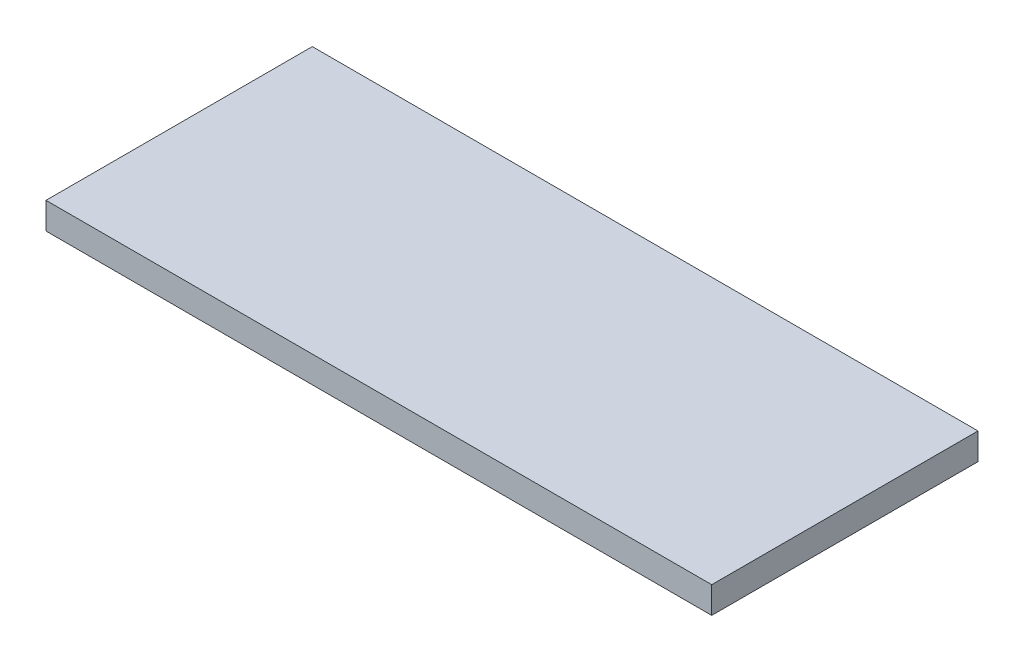
ISO-10303-21;
HEADER;
FILE_DESCRIPTION(('STEP AP214'),'2;1');
FILE_NAME('part.step','',(''),(''),'','','');
FILE_SCHEMA(('AUTOMOTIVE_DESIGN { 1 0 10303 214 1 1 1 1 }'));
ENDSEC;
DATA;
#1=APPLICATION_CONTEXT('core data for automotive mechanical design processes');
#2=APPLICATION_PROTOCOL_DEFINITION('international standard','automotive_design',2000,#1);
#3=PRODUCT_CONTEXT('',#1,'mechanical');
#4=PRODUCT('Part','Part','',(#3));
#5=PRODUCT_RELATED_PRODUCT_CATEGORY('part','',(#4));
#6=PRODUCT_DEFINITION_FORMATION('','',#4);
#7=PRODUCT_DEFINITION_CONTEXT('part definition',#1,'design');
#8=PRODUCT_DEFINITION('design','',#6,#7);
#9=PRODUCT_DEFINITION_SHAPE('','',#8);
#10=(LENGTH_UNIT() NAMED_UNIT(*) SI_UNIT(.MILLI.,.METRE.));
#11=(NAMED_UNIT(*) PLANE_ANGLE_UNIT() SI_UNIT($,.RADIAN.));
#12=(NAMED_UNIT(*) SI_UNIT($,.STERADIAN.) SOLID_ANGLE_UNIT());
#13=UNCERTAINTY_MEASURE_WITH_UNIT(LENGTH_MEASURE(1.E-05),#10,'distance_accuracy_value','');
#14=(GEOMETRIC_REPRESENTATION_CONTEXT(3) GLOBAL_UNCERTAINTY_ASSIGNED_CONTEXT((#13)) GLOBAL_UNIT_ASSIGNED_CONTEXT((#10,
#11,#12)) REPRESENTATION_CONTEXT('',''));
#15=CARTESIAN_POINT('',(0.,0.,0.));
#16=DIRECTION('',(0.,0.,1.));
#17=DIRECTION('',(1.,0.,0.));
#18=AXIS2_PLACEMENT_3D('',#15,#16,#17);
#19=CARTESIAN_POINT('',(2500.,200.,1000.));
#20=DIRECTION('',(-1.,0.,0.));
#21=DIRECTION('',(0.,0.,1.));
#22=AXIS2_PLACEMENT_3D('',#19,#20,#21);
#23=PLANE('',#22);
#24=DIRECTION('',(0.,0.,-1.));
#25=VECTOR('',#24,1.);
#26=CARTESIAN_POINT('',(2500.,0.,1000.));
#27=LINE('',#26,#25);
#28=CARTESIAN_POINT('',(2500.,0.,1000.));
#29=VERTEX_POINT('',#28);
#30=CARTESIAN_POINT('',(2500.,0.,-1000.));
#31=VERTEX_POINT('',#30);
#32=EDGE_CURVE('E96',#29,#31,#27,.T.);
#33=ORIENTED_EDGE('',*,*,#32,.T.);
#34=DIRECTION('',(0.,-1.,0.));
#35=VECTOR('',#34,1.);
#36=CARTESIAN_POINT('',(2500.,200.,-1000.));
#37=LINE('',#36,#35);
#38=CARTESIAN_POINT('',(2500.,200.,-1000.));
#39=VERTEX_POINT('',#38);
#40=EDGE_CURVE('E11',#39,#31,#37,.T.);
#41=ORIENTED_EDGE('',*,*,#40,.F.);
#42=DIRECTION('',(0.,0.,-1.));
#43=VECTOR('',#42,1.);
#44=CARTESIAN_POINT('',(2500.,200.,1000.));
#45=LINE('',#44,#43);
#46=CARTESIAN_POINT('',(2500.,200.,1000.));
#47=VERTEX_POINT('',#46);
#48=EDGE_CURVE('E84',#47,#39,#45,.T.);
#49=ORIENTED_EDGE('',*,*,#48,.F.);
#50=DIRECTION('',(0.,-1.,0.));
#51=VECTOR('',#50,1.);
#52=CARTESIAN_POINT('',(2500.,200.,1000.));
#53=LINE('',#52,#51);
#54=EDGE_CURVE('E92',#47,#29,#53,.T.);
#55=ORIENTED_EDGE('',*,*,#54,.T.);
#56=EDGE_LOOP('',(#33,#41,#49,#55));
#57=FACE_BOUND('',#56,.T.);
#58=ADVANCED_FACE('F33',(#57),#23,.F.);
#59=CARTESIAN_POINT('',(-2500.,200.,-1000.));
#60=DIRECTION('',(0.,0.,1.));
#61=DIRECTION('',(1.,0.,0.));
#62=AXIS2_PLACEMENT_3D('',#59,#60,#61);
#63=PLANE('',#62);
#64=DIRECTION('',(-1.,0.,0.));
#65=VECTOR('',#64,1.);
#66=CARTESIAN_POINT('',(-2500.,0.,-1000.));
#67=LINE('',#66,#65);
#68=CARTESIAN_POINT('',(-2500.,0.,-1000.));
#69=VERTEX_POINT('',#68);
#70=EDGE_CURVE('E88',#31,#69,#67,.T.);
#71=ORIENTED_EDGE('',*,*,#70,.T.);
#72=DIRECTION('',(0.,-1.,0.));
#73=VECTOR('',#72,1.);
#74=CARTESIAN_POINT('',(-2500.,200.,-1000.));
#75=LINE('',#74,#73);
#76=CARTESIAN_POINT('',(-2500.,200.,-1000.));
#77=VERTEX_POINT('',#76);
#78=EDGE_CURVE('E41',#77,#69,#75,.T.);
#79=ORIENTED_EDGE('',*,*,#78,.F.);
#80=DIRECTION('',(-1.,0.,0.));
#81=VECTOR('',#80,1.);
#82=CARTESIAN_POINT('',(-2500.,200.,-1000.));
#83=LINE('',#82,#81);
#84=EDGE_CURVE('E79',#39,#77,#83,.T.);
#85=ORIENTED_EDGE('',*,*,#84,.F.);
#86=ORIENTED_EDGE('',*,*,#40,.T.);
#87=EDGE_LOOP('',(#71,#79,#85,#86));
#88=FACE_BOUND('',#87,.T.);
#89=ADVANCED_FACE('F87',(#88),#63,.F.);
#90=CARTESIAN_POINT('',(-2500.,200.,1000.));
#91=DIRECTION('',(1.,0.,0.));
#92=DIRECTION('',(0.,0.,-1.));
#93=AXIS2_PLACEMENT_3D('',#90,#91,#92);
#94=PLANE('',#93);
#95=DIRECTION('',(0.,0.,1.));
#96=VECTOR('',#95,1.);
#97=CARTESIAN_POINT('',(-2500.,0.,1000.));
#98=LINE('',#97,#96);
#99=CARTESIAN_POINT('',(-2500.,0.,1000.));
#100=VERTEX_POINT('',#99);
#101=EDGE_CURVE('E66',#69,#100,#98,.T.);
#102=ORIENTED_EDGE('',*,*,#101,.T.);
#103=DIRECTION('',(0.,-1.,0.));
#104=VECTOR('',#103,1.);
#105=CARTESIAN_POINT('',(-2500.,200.,1000.));
#106=LINE('',#105,#104);
#107=CARTESIAN_POINT('',(-2500.,200.,1000.));
#108=VERTEX_POINT('',#107);
#109=EDGE_CURVE('E89',#108,#100,#106,.T.);
#110=ORIENTED_EDGE('',*,*,#109,.F.);
#111=DIRECTION('',(0.,0.,1.));
#112=VECTOR('',#111,1.);
#113=CARTESIAN_POINT('',(-2500.,200.,1000.));
#114=LINE('',#113,#112);
#115=EDGE_CURVE('E82',#77,#108,#114,.T.);
#116=ORIENTED_EDGE('',*,*,#115,.F.);
#117=ORIENTED_EDGE('',*,*,#78,.T.);
#118=EDGE_LOOP('',(#102,#110,#116,#117));
#119=FACE_BOUND('',#118,.T.);
#120=ADVANCED_FACE('F90',(#119),#94,.F.);
#121=CARTESIAN_POINT('',(-2500.,200.,1000.));
#122=DIRECTION('',(0.,0.,-1.));
#123=DIRECTION('',(-1.,0.,0.));
#124=AXIS2_PLACEMENT_3D('',#121,#122,#123);
#125=PLANE('',#124);
#126=DIRECTION('',(1.,0.,0.));
#127=VECTOR('',#126,1.);
#128=CARTESIAN_POINT('',(-2500.,0.,1000.));
#129=LINE('',#128,#127);
#130=EDGE_CURVE('E72',#100,#29,#129,.T.);
#131=ORIENTED_EDGE('',*,*,#130,.T.);
#132=ORIENTED_EDGE('',*,*,#54,.F.);
#133=DIRECTION('',(1.,0.,0.));
#134=VECTOR('',#133,1.);
#135=CARTESIAN_POINT('',(-2500.,200.,1000.));
#136=LINE('',#135,#134);
#137=EDGE_CURVE('E49',#108,#47,#136,.T.);
#138=ORIENTED_EDGE('',*,*,#137,.F.);
#139=ORIENTED_EDGE('',*,*,#109,.T.);
#140=EDGE_LOOP('',(#131,#132,#138,#139));
#141=FACE_BOUND('',#140,.T.);
#142=ADVANCED_FACE('F103',(#141),#125,.F.);
#143=CARTESIAN_POINT('',(0.,200.,0.));
#144=DIRECTION('',(0.,-1.,0.));
#145=DIRECTION('',(0.,0.,-1.));
#146=AXIS2_PLACEMENT_3D('',#143,#144,#145);
#147=PLANE('',#146);
#148=ORIENTED_EDGE('',*,*,#48,.T.);
#149=ORIENTED_EDGE('',*,*,#84,.T.);
#150=ORIENTED_EDGE('',*,*,#115,.T.);
#151=ORIENTED_EDGE('',*,*,#137,.T.);
#152=EDGE_LOOP('',(#148,#149,#150,#151));
#153=FACE_BOUND('',#152,.T.);
#154=ADVANCED_FACE('F80',(#153),#147,.F.);
#155=CARTESIAN_POINT('',(0.,0.,0.));
#156=DIRECTION('',(0.,-1.,0.));
#157=DIRECTION('',(0.,0.,-1.));
#158=AXIS2_PLACEMENT_3D('',#155,#156,#157);
#159=PLANE('',#158);
#160=ORIENTED_EDGE('',*,*,#32,.F.);
#161=ORIENTED_EDGE('',*,*,#130,.F.);
#162=ORIENTED_EDGE('',*,*,#101,.F.);
#163=ORIENTED_EDGE('',*,*,#70,.F.);
#164=EDGE_LOOP('',(#160,#161,#162,#163));
#165=FACE_BOUND('',#164,.T.);
#166=ADVANCED_FACE('F106',(#165),#159,.T.);
#167=CLOSED_SHELL('',(#58,#89,#120,#142,#154,#166));
#168=MANIFOLD_SOLID_BREP('B2',#167);
#169=ADVANCED_BREP_SHAPE_REPRESENTATION('',(#18,#168),#14);
#170=SHAPE_DEFINITION_REPRESENTATION(#9,#169);
ENDSEC;
END-ISO-10303-21;
